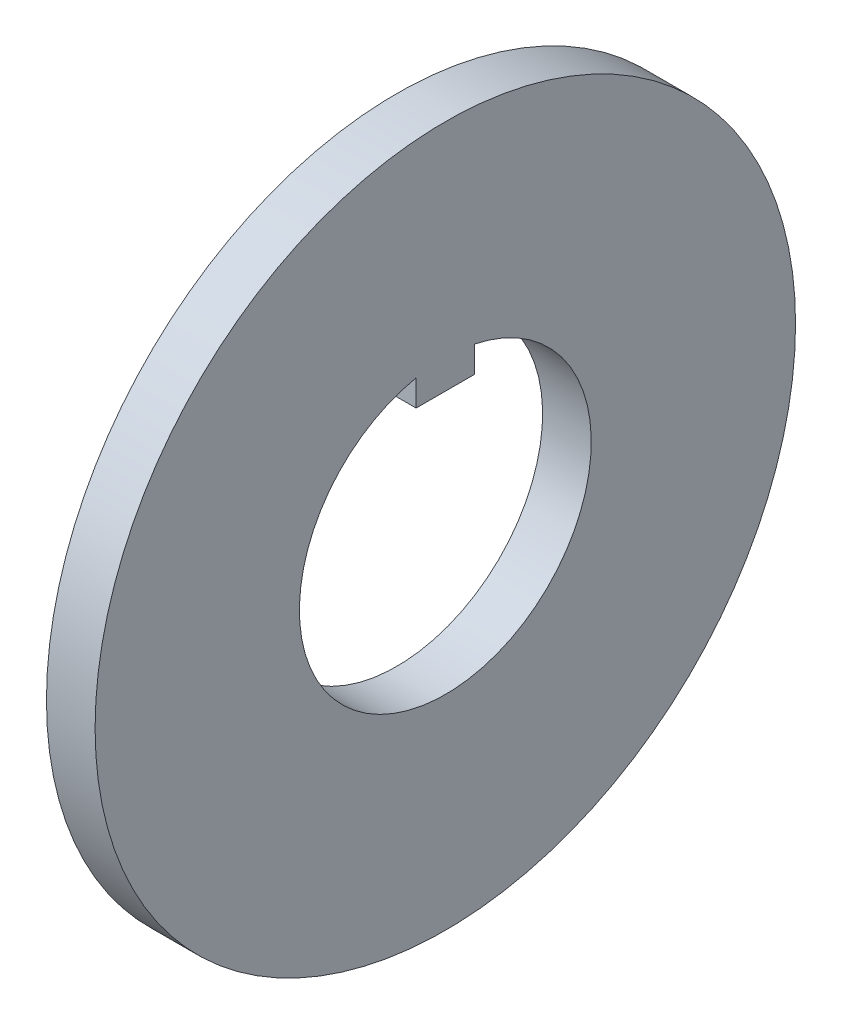
ISO-10303-21;
HEADER;
FILE_DESCRIPTION(('STEP AP214'),'2;1');
FILE_NAME('part.step','',(''),(''),'','','');
FILE_SCHEMA(('AUTOMOTIVE_DESIGN { 1 0 10303 214 1 1 1 1 }'));
ENDSEC;
DATA;
#1=APPLICATION_CONTEXT('core data for automotive mechanical design processes');
#2=APPLICATION_PROTOCOL_DEFINITION('international standard','automotive_design',2000,#1);
#3=PRODUCT_CONTEXT('',#1,'mechanical');
#4=PRODUCT('Part','Part','',(#3));
#5=PRODUCT_RELATED_PRODUCT_CATEGORY('part','',(#4));
#6=PRODUCT_DEFINITION_FORMATION('','',#4);
#7=PRODUCT_DEFINITION_CONTEXT('part definition',#1,'design');
#8=PRODUCT_DEFINITION('design','',#6,#7);
#9=PRODUCT_DEFINITION_SHAPE('','',#8);
#10=(LENGTH_UNIT() NAMED_UNIT(*) SI_UNIT(.MILLI.,.METRE.));
#11=(NAMED_UNIT(*) PLANE_ANGLE_UNIT() SI_UNIT($,.RADIAN.));
#12=(NAMED_UNIT(*) SI_UNIT($,.STERADIAN.) SOLID_ANGLE_UNIT());
#13=UNCERTAINTY_MEASURE_WITH_UNIT(LENGTH_MEASURE(1.E-05),#10,'distance_accuracy_value','');
#14=(GEOMETRIC_REPRESENTATION_CONTEXT(3) GLOBAL_UNCERTAINTY_ASSIGNED_CONTEXT((#13)) GLOBAL_UNIT_ASSIGNED_CONTEXT((#10,
#11,#12)) REPRESENTATION_CONTEXT('',''));
#15=CARTESIAN_POINT('',(0.,0.,0.));
#16=DIRECTION('',(0.,0.,1.));
#17=DIRECTION('',(1.,0.,0.));
#18=AXIS2_PLACEMENT_3D('',#15,#16,#17);
#19=CARTESIAN_POINT('',(12.7,0.,0.));
#20=DIRECTION('',(1.,0.,0.));
#21=DIRECTION('',(0.,0.,-1.));
#22=AXIS2_PLACEMENT_3D('',#19,#20,#21);
#23=PLANE('',#22);
#24=CARTESIAN_POINT('',(12.7,0.,0.));
#25=DIRECTION('',(1.,0.,0.));
#26=DIRECTION('',(0.,0.,-1.));
#27=AXIS2_PLACEMENT_3D('',#24,#25,#26);
#28=CIRCLE('',#27,91.44);
#29=CARTESIAN_POINT('',(12.7,0.,-91.44));
#30=VERTEX_POINT('',#29);
#31=EDGE_CURVE('E11',#30,#30,#28,.T.);
#32=ORIENTED_EDGE('',*,*,#31,.T.);
#33=EDGE_LOOP('',(#32));
#34=FACE_BOUND('',#33,.T.);
#35=DIRECTION('',(0.,1.,0.));
#36=VECTOR('',#35,1.);
#37=CARTESIAN_POINT('',(12.7,0.,-7.62));
#38=LINE('',#37,#36);
#39=CARTESIAN_POINT('',(12.7,30.48,-7.62));
#40=VERTEX_POINT('',#39);
#41=CARTESIAN_POINT('',(12.7,37.3302236800156,-7.62));
#42=VERTEX_POINT('',#41);
#43=EDGE_CURVE('E100',#40,#42,#38,.T.);
#44=ORIENTED_EDGE('',*,*,#43,.T.);
#45=CARTESIAN_POINT('',(12.7,0.,0.));
#46=DIRECTION('',(1.,0.,0.));
#47=DIRECTION('',(0.,0.,-1.));
#48=AXIS2_PLACEMENT_3D('',#45,#46,#47);
#49=CIRCLE('',#48,38.1);
#50=CARTESIAN_POINT('',(12.7,37.3302236800156,7.62));
#51=VERTEX_POINT('',#50);
#52=EDGE_CURVE('E48',#42,#51,#49,.F.);
#53=ORIENTED_EDGE('',*,*,#52,.T.);
#54=DIRECTION('',(0.,1.,0.));
#55=VECTOR('',#54,1.);
#56=CARTESIAN_POINT('',(12.7,0.,7.62));
#57=LINE('',#56,#55);
#58=CARTESIAN_POINT('',(12.7,30.48,7.62));
#59=VERTEX_POINT('',#58);
#60=EDGE_CURVE('E91',#59,#51,#57,.T.);
#61=ORIENTED_EDGE('',*,*,#60,.F.);
#62=DIRECTION('',(0.,0.,1.));
#63=VECTOR('',#62,1.);
#64=CARTESIAN_POINT('',(12.7,30.48,0.));
#65=LINE('',#64,#63);
#66=EDGE_CURVE('E94',#40,#59,#65,.T.);
#67=ORIENTED_EDGE('',*,*,#66,.F.);
#68=EDGE_LOOP('',(#44,#53,#61,#67));
#69=FACE_BOUND('',#68,.T.);
#70=ADVANCED_FACE('F33',(#34,#69),#23,.T.);
#71=CARTESIAN_POINT('',(0.,0.,0.));
#72=DIRECTION('',(1.,0.,0.));
#73=DIRECTION('',(0.,0.,-1.));
#74=AXIS2_PLACEMENT_3D('',#71,#72,#73);
#75=PLANE('',#74);
#76=CARTESIAN_POINT('',(0.,0.,0.));
#77=DIRECTION('',(1.,0.,0.));
#78=DIRECTION('',(0.,0.,-1.));
#79=AXIS2_PLACEMENT_3D('',#76,#77,#78);
#80=CIRCLE('',#79,91.44);
#81=CARTESIAN_POINT('',(0.,0.,-91.44));
#82=VERTEX_POINT('',#81);
#83=EDGE_CURVE('E37',#82,#82,#80,.T.);
#84=ORIENTED_EDGE('',*,*,#83,.F.);
#85=EDGE_LOOP('',(#84));
#86=FACE_BOUND('',#85,.T.);
#87=CARTESIAN_POINT('',(0.,0.,0.));
#88=DIRECTION('',(1.,0.,0.));
#89=DIRECTION('',(0.,0.,-1.));
#90=AXIS2_PLACEMENT_3D('',#87,#88,#89);
#91=CIRCLE('',#90,38.1);
#92=CARTESIAN_POINT('',(0.,37.3302236800156,-7.62));
#93=VERTEX_POINT('',#92);
#94=CARTESIAN_POINT('',(0.,37.3302236800156,7.62));
#95=VERTEX_POINT('',#94);
#96=EDGE_CURVE('E82',#93,#95,#91,.F.);
#97=ORIENTED_EDGE('',*,*,#96,.F.);
#98=DIRECTION('',(0.,1.,0.));
#99=VECTOR('',#98,1.);
#100=CARTESIAN_POINT('',(0.,0.,-7.62));
#101=LINE('',#100,#99);
#102=CARTESIAN_POINT('',(0.,30.48,-7.62));
#103=VERTEX_POINT('',#102);
#104=EDGE_CURVE('E74',#103,#93,#101,.T.);
#105=ORIENTED_EDGE('',*,*,#104,.F.);
#106=DIRECTION('',(0.,0.,1.));
#107=VECTOR('',#106,1.);
#108=CARTESIAN_POINT('',(0.,30.48,0.));
#109=LINE('',#108,#107);
#110=CARTESIAN_POINT('',(0.,30.48,7.62));
#111=VERTEX_POINT('',#110);
#112=EDGE_CURVE('E56',#103,#111,#109,.T.);
#113=ORIENTED_EDGE('',*,*,#112,.T.);
#114=DIRECTION('',(0.,1.,0.));
#115=VECTOR('',#114,1.);
#116=CARTESIAN_POINT('',(0.,0.,7.62));
#117=LINE('',#116,#115);
#118=EDGE_CURVE('E86',#111,#95,#117,.T.);
#119=ORIENTED_EDGE('',*,*,#118,.T.);
#120=EDGE_LOOP('',(#97,#105,#113,#119));
#121=FACE_BOUND('',#120,.T.);
#122=ADVANCED_FACE('F89',(#86,#121),#75,.F.);
#123=CARTESIAN_POINT('',(12.7,0.,0.));
#124=DIRECTION('',(-1.,0.,0.));
#125=DIRECTION('',(0.,0.,1.));
#126=AXIS2_PLACEMENT_3D('',#123,#124,#125);
#127=CYLINDRICAL_SURFACE('',#126,91.44);
#128=ORIENTED_EDGE('',*,*,#31,.F.);
#129=EDGE_LOOP('',(#128));
#130=FACE_BOUND('',#129,.T.);
#131=ORIENTED_EDGE('',*,*,#83,.T.);
#132=EDGE_LOOP('',(#131));
#133=FACE_BOUND('',#132,.T.);
#134=ADVANCED_FACE('F35',(#130,#133),#127,.T.);
#135=CARTESIAN_POINT('',(0.,0.,0.));
#136=DIRECTION('',(1.,0.,0.));
#137=DIRECTION('',(0.,0.,-1.));
#138=AXIS2_PLACEMENT_3D('',#135,#136,#137);
#139=CYLINDRICAL_SURFACE('',#138,38.1);
#140=ORIENTED_EDGE('',*,*,#52,.F.);
#141=DIRECTION('',(1.,0.,0.));
#142=VECTOR('',#141,1.);
#143=CARTESIAN_POINT('',(0.,37.3302236800156,-7.62));
#144=LINE('',#143,#142);
#145=EDGE_CURVE('E77',#93,#42,#144,.T.);
#146=ORIENTED_EDGE('',*,*,#145,.F.);
#147=ORIENTED_EDGE('',*,*,#96,.T.);
#148=DIRECTION('',(1.,0.,0.));
#149=VECTOR('',#148,1.);
#150=CARTESIAN_POINT('',(0.,37.3302236800156,7.62));
#151=LINE('',#150,#149);
#152=EDGE_CURVE('E104',#95,#51,#151,.T.);
#153=ORIENTED_EDGE('',*,*,#152,.T.);
#154=EDGE_LOOP('',(#140,#146,#147,#153));
#155=FACE_BOUND('',#154,.T.);
#156=ADVANCED_FACE('F84',(#155),#139,.F.);
#157=CARTESIAN_POINT('',(0.,0.,7.62));
#158=DIRECTION('',(0.,0.,-1.));
#159=DIRECTION('',(-1.,0.,0.));
#160=AXIS2_PLACEMENT_3D('',#157,#158,#159);
#161=PLANE('',#160);
#162=ORIENTED_EDGE('',*,*,#60,.T.);
#163=ORIENTED_EDGE('',*,*,#152,.F.);
#164=ORIENTED_EDGE('',*,*,#118,.F.);
#165=DIRECTION('',(1.,0.,0.));
#166=VECTOR('',#165,1.);
#167=CARTESIAN_POINT('',(0.,30.48,7.62));
#168=LINE('',#167,#166);
#169=EDGE_CURVE('E106',#111,#59,#168,.T.);
#170=ORIENTED_EDGE('',*,*,#169,.T.);
#171=EDGE_LOOP('',(#162,#163,#164,#170));
#172=FACE_BOUND('',#171,.T.);
#173=ADVANCED_FACE('F113',(#172),#161,.F.);
#174=CARTESIAN_POINT('',(0.,30.48,0.));
#175=DIRECTION('',(0.,1.,0.));
#176=DIRECTION('',(0.,0.,1.));
#177=AXIS2_PLACEMENT_3D('',#174,#175,#176);
#178=PLANE('',#177);
#179=ORIENTED_EDGE('',*,*,#66,.T.);
#180=ORIENTED_EDGE('',*,*,#169,.F.);
#181=ORIENTED_EDGE('',*,*,#112,.F.);
#182=DIRECTION('',(1.,0.,0.));
#183=VECTOR('',#182,1.);
#184=CARTESIAN_POINT('',(0.,30.48,-7.62));
#185=LINE('',#184,#183);
#186=EDGE_CURVE('E79',#103,#40,#185,.T.);
#187=ORIENTED_EDGE('',*,*,#186,.T.);
#188=EDGE_LOOP('',(#179,#180,#181,#187));
#189=FACE_BOUND('',#188,.T.);
#190=ADVANCED_FACE('F108',(#189),#178,.F.);
#191=CARTESIAN_POINT('',(0.,0.,-7.62));
#192=DIRECTION('',(0.,0.,-1.));
#193=DIRECTION('',(-1.,0.,0.));
#194=AXIS2_PLACEMENT_3D('',#191,#192,#193);
#195=PLANE('',#194);
#196=ORIENTED_EDGE('',*,*,#43,.F.);
#197=ORIENTED_EDGE('',*,*,#186,.F.);
#198=ORIENTED_EDGE('',*,*,#104,.T.);
#199=ORIENTED_EDGE('',*,*,#145,.T.);
#200=EDGE_LOOP('',(#196,#197,#198,#199));
#201=FACE_BOUND('',#200,.T.);
#202=ADVANCED_FACE('F76',(#201),#195,.T.);
#203=CLOSED_SHELL('',(#70,#122,#134,#156,#173,#190,#202));
#204=MANIFOLD_SOLID_BREP('B2',#203);
#205=ADVANCED_BREP_SHAPE_REPRESENTATION('',(#18,#204),#14);
#206=SHAPE_DEFINITION_REPRESENTATION(#9,#205);
ENDSEC;
END-ISO-10303-21;
